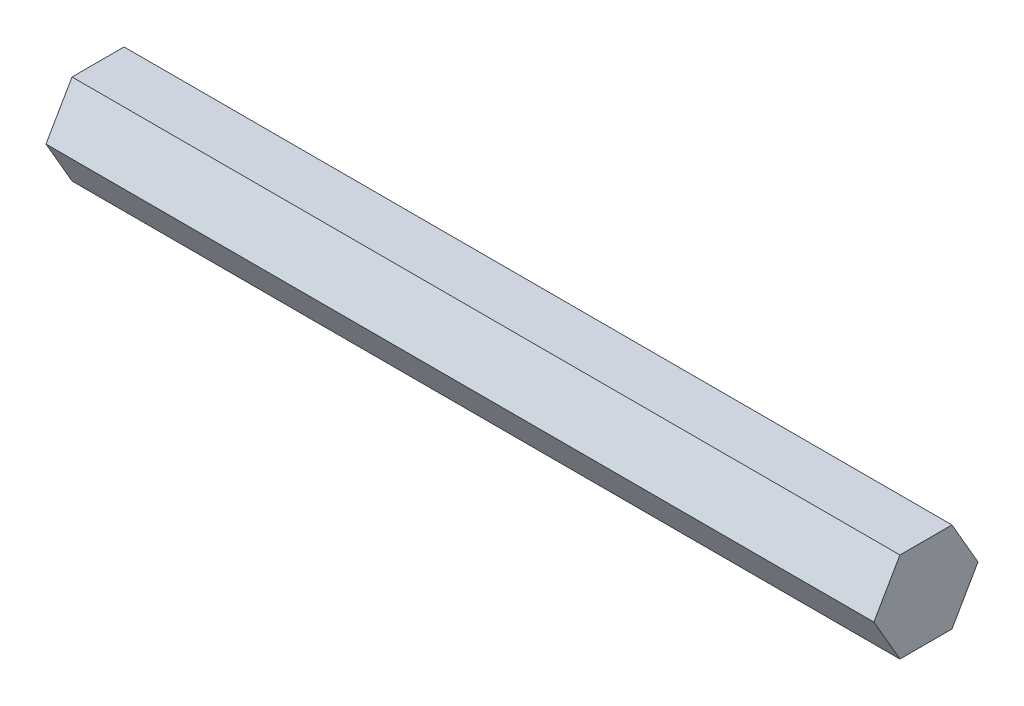
ISO-10303-21;
HEADER;
FILE_DESCRIPTION(('STEP AP214'),'2;1');
FILE_NAME('part.step','',(''),(''),'','','');
FILE_SCHEMA(('AUTOMOTIVE_DESIGN { 1 0 10303 214 1 1 1 1 }'));
ENDSEC;
DATA;
#1=APPLICATION_CONTEXT('core data for automotive mechanical design processes');
#2=APPLICATION_PROTOCOL_DEFINITION('international standard','automotive_design',2000,#1);
#3=PRODUCT_CONTEXT('',#1,'mechanical');
#4=PRODUCT('Part','Part','',(#3));
#5=PRODUCT_RELATED_PRODUCT_CATEGORY('part','',(#4));
#6=PRODUCT_DEFINITION_FORMATION('','',#4);
#7=PRODUCT_DEFINITION_CONTEXT('part definition',#1,'design');
#8=PRODUCT_DEFINITION('design','',#6,#7);
#9=PRODUCT_DEFINITION_SHAPE('','',#8);
#10=(LENGTH_UNIT() NAMED_UNIT(*) SI_UNIT(.MILLI.,.METRE.));
#11=(NAMED_UNIT(*) PLANE_ANGLE_UNIT() SI_UNIT($,.RADIAN.));
#12=(NAMED_UNIT(*) SI_UNIT($,.STERADIAN.) SOLID_ANGLE_UNIT());
#13=UNCERTAINTY_MEASURE_WITH_UNIT(LENGTH_MEASURE(1.E-05),#10,'distance_accuracy_value','');
#14=(GEOMETRIC_REPRESENTATION_CONTEXT(3) GLOBAL_UNCERTAINTY_ASSIGNED_CONTEXT((#13)) GLOBAL_UNIT_ASSIGNED_CONTEXT((#10,
#11,#12)) REPRESENTATION_CONTEXT('',''));
#15=CARTESIAN_POINT('',(0.,0.,0.));
#16=DIRECTION('',(0.,0.,1.));
#17=DIRECTION('',(1.,0.,0.));
#18=AXIS2_PLACEMENT_3D('',#15,#16,#17);
#19=CARTESIAN_POINT('',(45.,-2.44999999999997,-1.4145081595146));
#20=DIRECTION('',(0.,0.499999999999995,0.866025403784441));
#21=DIRECTION('',(0.,-0.866025403784442,0.499999999999995));
#22=AXIS2_PLACEMENT_3D('',#19,#20,#21);
#23=PLANE('',#22);
#24=DIRECTION('',(0.,0.866025403784441,-0.499999999999995));
#25=VECTOR('',#24,1.);
#26=CARTESIAN_POINT('',(0.,-2.44999999999997,-1.4145081595146));
#27=LINE('',#26,#25);
#28=CARTESIAN_POINT('',(0.,-2.44999999999997,-1.4145081595146));
#29=VERTEX_POINT('',#28);
#30=CARTESIAN_POINT('',(0.,0.,-2.82901631902915));
#31=VERTEX_POINT('',#30);
#32=EDGE_CURVE('E134',#29,#31,#27,.T.);
#33=ORIENTED_EDGE('',*,*,#32,.T.);
#34=DIRECTION('',(-1.,0.,0.));
#35=VECTOR('',#34,1.);
#36=CARTESIAN_POINT('',(45.,0.,-2.82901631902915));
#37=LINE('',#36,#35);
#38=CARTESIAN_POINT('',(45.,0.,-2.82901631902915));
#39=VERTEX_POINT('',#38);
#40=EDGE_CURVE('E11',#39,#31,#37,.T.);
#41=ORIENTED_EDGE('',*,*,#40,.F.);
#42=DIRECTION('',(0.,0.866025403784441,-0.499999999999995));
#43=VECTOR('',#42,1.);
#44=CARTESIAN_POINT('',(45.,-2.44999999999997,-1.4145081595146));
#45=LINE('',#44,#43);
#46=CARTESIAN_POINT('',(45.,-2.44999999999997,-1.4145081595146));
#47=VERTEX_POINT('',#46);
#48=EDGE_CURVE('E150',#47,#39,#45,.T.);
#49=ORIENTED_EDGE('',*,*,#48,.F.);
#50=DIRECTION('',(-1.,0.,0.));
#51=VECTOR('',#50,1.);
#52=CARTESIAN_POINT('',(45.,-2.44999999999997,-1.4145081595146));
#53=LINE('',#52,#51);
#54=EDGE_CURVE('E130',#47,#29,#53,.T.);
#55=ORIENTED_EDGE('',*,*,#54,.T.);
#56=EDGE_LOOP('',(#33,#41,#49,#55));
#57=FACE_BOUND('',#56,.T.);
#58=ADVANCED_FACE('F45',(#57),#23,.F.);
#59=CARTESIAN_POINT('',(45.,0.,-2.82901631902915));
#60=DIRECTION('',(0.,-0.500000000000001,0.866025403784438));
#61=DIRECTION('',(0.,-0.866025403784438,-0.500000000000001));
#62=AXIS2_PLACEMENT_3D('',#59,#60,#61);
#63=PLANE('',#62);
#64=DIRECTION('',(0.,0.866025403784438,0.500000000000001));
#65=VECTOR('',#64,1.);
#66=CARTESIAN_POINT('',(0.,0.,-2.82901631902915));
#67=LINE('',#66,#65);
#68=CARTESIAN_POINT('',(0.,2.44999999999999,-1.41450815951457));
#69=VERTEX_POINT('',#68);
#70=EDGE_CURVE('E138',#31,#69,#67,.T.);
#71=ORIENTED_EDGE('',*,*,#70,.T.);
#72=DIRECTION('',(-1.,0.,0.));
#73=VECTOR('',#72,1.);
#74=CARTESIAN_POINT('',(45.,2.44999999999999,-1.41450815951457));
#75=LINE('',#74,#73);
#76=CARTESIAN_POINT('',(45.,2.44999999999999,-1.41450815951457));
#77=VERTEX_POINT('',#76);
#78=EDGE_CURVE('E54',#77,#69,#75,.T.);
#79=ORIENTED_EDGE('',*,*,#78,.F.);
#80=DIRECTION('',(0.,0.866025403784438,0.500000000000001));
#81=VECTOR('',#80,1.);
#82=CARTESIAN_POINT('',(45.,0.,-2.82901631902915));
#83=LINE('',#82,#81);
#84=EDGE_CURVE('E99',#39,#77,#83,.T.);
#85=ORIENTED_EDGE('',*,*,#84,.F.);
#86=ORIENTED_EDGE('',*,*,#40,.T.);
#87=EDGE_LOOP('',(#71,#79,#85,#86));
#88=FACE_BOUND('',#87,.T.);
#89=ADVANCED_FACE('F178',(#88),#63,.F.);
#90=CARTESIAN_POINT('',(45.,2.44999999999999,-1.41450815951457));
#91=DIRECTION('',(0.,-1.,0.));
#92=DIRECTION('',(0.,0.,-1.));
#93=AXIS2_PLACEMENT_3D('',#90,#91,#92);
#94=PLANE('',#93);
#95=DIRECTION('',(0.,0.,1.));
#96=VECTOR('',#95,1.);
#97=CARTESIAN_POINT('',(0.,2.44999999999999,-1.41450815951457));
#98=LINE('',#97,#96);
#99=CARTESIAN_POINT('',(0.,2.44999999999998,1.41450815951459));
#100=VERTEX_POINT('',#99);
#101=EDGE_CURVE('E141',#69,#100,#98,.T.);
#102=ORIENTED_EDGE('',*,*,#101,.T.);
#103=DIRECTION('',(-1.,0.,0.));
#104=VECTOR('',#103,1.);
#105=CARTESIAN_POINT('',(45.,2.44999999999998,1.41450815951459));
#106=LINE('',#105,#104);
#107=CARTESIAN_POINT('',(45.,2.44999999999998,1.41450815951459));
#108=VERTEX_POINT('',#107);
#109=EDGE_CURVE('E123',#108,#100,#106,.T.);
#110=ORIENTED_EDGE('',*,*,#109,.F.);
#111=DIRECTION('',(0.,0.,1.));
#112=VECTOR('',#111,1.);
#113=CARTESIAN_POINT('',(45.,2.44999999999999,-1.41450815951457));
#114=LINE('',#113,#112);
#115=EDGE_CURVE('E112',#77,#108,#114,.T.);
#116=ORIENTED_EDGE('',*,*,#115,.F.);
#117=ORIENTED_EDGE('',*,*,#78,.T.);
#118=EDGE_LOOP('',(#102,#110,#116,#117));
#119=FACE_BOUND('',#118,.T.);
#120=ADVANCED_FACE('F160',(#119),#94,.F.);
#121=CARTESIAN_POINT('',(45.,2.44999999999998,1.41450815951459));
#122=DIRECTION('',(0.,-0.499999999999995,-0.866025403784442));
#123=DIRECTION('',(0.,0.866025403784442,-0.499999999999995));
#124=AXIS2_PLACEMENT_3D('',#121,#122,#123);
#125=PLANE('',#124);
#126=DIRECTION('',(0.,-0.866025403784442,0.499999999999995));
#127=VECTOR('',#126,1.);
#128=CARTESIAN_POINT('',(0.,2.44999999999998,1.41450815951459));
#129=LINE('',#128,#127);
#130=CARTESIAN_POINT('',(0.,0.,2.82901631902915));
#131=VERTEX_POINT('',#130);
#132=EDGE_CURVE('E121',#100,#131,#129,.T.);
#133=ORIENTED_EDGE('',*,*,#132,.T.);
#134=DIRECTION('',(-1.,0.,0.));
#135=VECTOR('',#134,1.);
#136=CARTESIAN_POINT('',(45.,0.,2.82901631902915));
#137=LINE('',#136,#135);
#138=CARTESIAN_POINT('',(45.,0.,2.82901631902915));
#139=VERTEX_POINT('',#138);
#140=EDGE_CURVE('E118',#139,#131,#137,.T.);
#141=ORIENTED_EDGE('',*,*,#140,.F.);
#142=DIRECTION('',(0.,-0.866025403784442,0.499999999999995));
#143=VECTOR('',#142,1.);
#144=CARTESIAN_POINT('',(45.,2.44999999999998,1.41450815951459));
#145=LINE('',#144,#143);
#146=EDGE_CURVE('E106',#108,#139,#145,.T.);
#147=ORIENTED_EDGE('',*,*,#146,.F.);
#148=ORIENTED_EDGE('',*,*,#109,.T.);
#149=EDGE_LOOP('',(#133,#141,#147,#148));
#150=FACE_BOUND('',#149,.T.);
#151=ADVANCED_FACE('F119',(#150),#125,.F.);
#152=CARTESIAN_POINT('',(45.,0.,2.82901631902915));
#153=DIRECTION('',(0.,0.500000000000007,-0.866025403784434));
#154=DIRECTION('',(0.,0.866025403784435,0.500000000000007));
#155=AXIS2_PLACEMENT_3D('',#152,#153,#154);
#156=PLANE('',#155);
#157=DIRECTION('',(0.,-0.866025403784434,-0.500000000000007));
#158=VECTOR('',#157,1.);
#159=CARTESIAN_POINT('',(0.,0.,2.82901631902915));
#160=LINE('',#159,#158);
#161=CARTESIAN_POINT('',(0.,-2.45,1.41450815951455));
#162=VERTEX_POINT('',#161);
#163=EDGE_CURVE('E85',#131,#162,#160,.T.);
#164=ORIENTED_EDGE('',*,*,#163,.T.);
#165=DIRECTION('',(-1.,0.,0.));
#166=VECTOR('',#165,1.);
#167=CARTESIAN_POINT('',(45.,-2.45,1.41450815951455));
#168=LINE('',#167,#166);
#169=CARTESIAN_POINT('',(45.,-2.45,1.41450815951455));
#170=VERTEX_POINT('',#169);
#171=EDGE_CURVE('E124',#170,#162,#168,.T.);
#172=ORIENTED_EDGE('',*,*,#171,.F.);
#173=DIRECTION('',(0.,-0.866025403784434,-0.500000000000007));
#174=VECTOR('',#173,1.);
#175=CARTESIAN_POINT('',(45.,0.,2.82901631902915));
#176=LINE('',#175,#174);
#177=EDGE_CURVE('E110',#139,#170,#176,.T.);
#178=ORIENTED_EDGE('',*,*,#177,.F.);
#179=ORIENTED_EDGE('',*,*,#140,.T.);
#180=EDGE_LOOP('',(#164,#172,#178,#179));
#181=FACE_BOUND('',#180,.T.);
#182=ADVANCED_FACE('F126',(#181),#156,.F.);
#183=CARTESIAN_POINT('',(45.,-2.45,1.41450815951455));
#184=DIRECTION('',(0.,1.,0.));
#185=DIRECTION('',(0.,0.,1.));
#186=AXIS2_PLACEMENT_3D('',#183,#184,#185);
#187=PLANE('',#186);
#188=DIRECTION('',(0.,0.,-1.));
#189=VECTOR('',#188,1.);
#190=CARTESIAN_POINT('',(0.,-2.45,1.41450815951455));
#191=LINE('',#190,#189);
#192=EDGE_CURVE('E91',#162,#29,#191,.T.);
#193=ORIENTED_EDGE('',*,*,#192,.T.);
#194=ORIENTED_EDGE('',*,*,#54,.F.);
#195=DIRECTION('',(0.,0.,-1.));
#196=VECTOR('',#195,1.);
#197=CARTESIAN_POINT('',(45.,-2.45,1.41450815951455));
#198=LINE('',#197,#196);
#199=EDGE_CURVE('E62',#170,#47,#198,.T.);
#200=ORIENTED_EDGE('',*,*,#199,.F.);
#201=ORIENTED_EDGE('',*,*,#171,.T.);
#202=EDGE_LOOP('',(#193,#194,#200,#201));
#203=FACE_BOUND('',#202,.T.);
#204=ADVANCED_FACE('F167',(#203),#187,.F.);
#205=CARTESIAN_POINT('',(45.,0.,0.));
#206=DIRECTION('',(1.,0.,0.));
#207=DIRECTION('',(0.,0.,-1.));
#208=AXIS2_PLACEMENT_3D('',#205,#206,#207);
#209=PLANE('',#208);
#210=ORIENTED_EDGE('',*,*,#48,.T.);
#211=ORIENTED_EDGE('',*,*,#84,.T.);
#212=ORIENTED_EDGE('',*,*,#115,.T.);
#213=ORIENTED_EDGE('',*,*,#146,.T.);
#214=ORIENTED_EDGE('',*,*,#177,.T.);
#215=ORIENTED_EDGE('',*,*,#199,.T.);
#216=EDGE_LOOP('',(#210,#211,#212,#213,#214,#215));
#217=FACE_BOUND('',#216,.T.);
#218=ADVANCED_FACE('F108',(#217),#209,.T.);
#219=CARTESIAN_POINT('',(0.,0.,0.));
#220=DIRECTION('',(1.,0.,0.));
#221=DIRECTION('',(0.,0.,-1.));
#222=AXIS2_PLACEMENT_3D('',#219,#220,#221);
#223=PLANE('',#222);
#224=ORIENTED_EDGE('',*,*,#32,.F.);
#225=ORIENTED_EDGE('',*,*,#192,.F.);
#226=ORIENTED_EDGE('',*,*,#163,.F.);
#227=ORIENTED_EDGE('',*,*,#132,.F.);
#228=ORIENTED_EDGE('',*,*,#101,.F.);
#229=ORIENTED_EDGE('',*,*,#70,.F.);
#230=EDGE_LOOP('',(#224,#225,#226,#227,#228,#229));
#231=FACE_BOUND('',#230,.T.);
#232=ADVANCED_FACE('F163',(#231),#223,.F.);
#233=CLOSED_SHELL('',(#58,#89,#120,#151,#182,#204,#218,#232));
#234=MANIFOLD_SOLID_BREP('B2',#233);
#235=ADVANCED_BREP_SHAPE_REPRESENTATION('',(#18,#234),#14);
#236=SHAPE_DEFINITION_REPRESENTATION(#9,#235);
ENDSEC;
END-ISO-10303-21;
